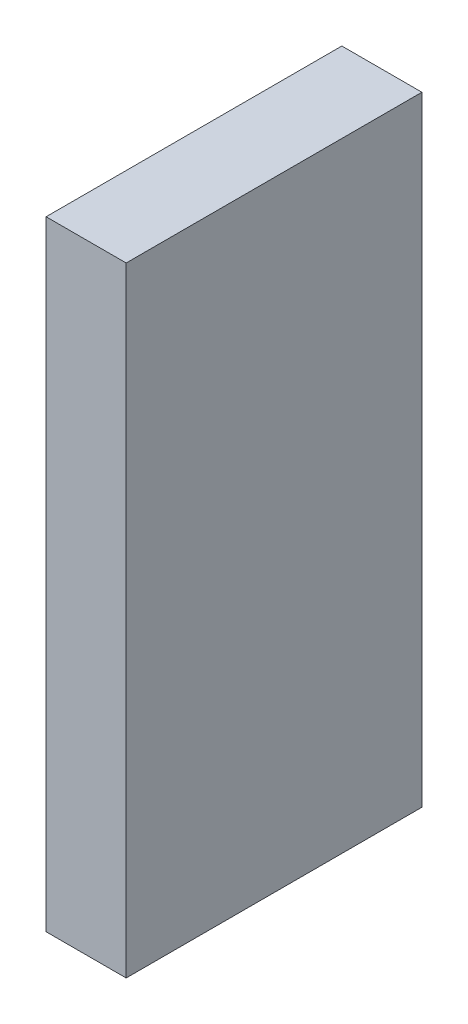
ISO-10303-21;
HEADER;
FILE_DESCRIPTION(('STEP AP214'),'2;1');
FILE_NAME('part.step','',(''),(''),'','','');
FILE_SCHEMA(('AUTOMOTIVE_DESIGN { 1 0 10303 214 1 1 1 1 }'));
ENDSEC;
DATA;
#1=APPLICATION_CONTEXT('core data for automotive mechanical design processes');
#2=APPLICATION_PROTOCOL_DEFINITION('international standard','automotive_design',2000,#1);
#3=PRODUCT_CONTEXT('',#1,'mechanical');
#4=PRODUCT('Part','Part','',(#3));
#5=PRODUCT_RELATED_PRODUCT_CATEGORY('part','',(#4));
#6=PRODUCT_DEFINITION_FORMATION('','',#4);
#7=PRODUCT_DEFINITION_CONTEXT('part definition',#1,'design');
#8=PRODUCT_DEFINITION('design','',#6,#7);
#9=PRODUCT_DEFINITION_SHAPE('','',#8);
#10=(LENGTH_UNIT() NAMED_UNIT(*) SI_UNIT(.MILLI.,.METRE.));
#11=(NAMED_UNIT(*) PLANE_ANGLE_UNIT() SI_UNIT($,.RADIAN.));
#12=(NAMED_UNIT(*) SI_UNIT($,.STERADIAN.) SOLID_ANGLE_UNIT());
#13=UNCERTAINTY_MEASURE_WITH_UNIT(LENGTH_MEASURE(1.E-05),#10,'distance_accuracy_value','');
#14=(GEOMETRIC_REPRESENTATION_CONTEXT(3) GLOBAL_UNCERTAINTY_ASSIGNED_CONTEXT((#13)) GLOBAL_UNIT_ASSIGNED_CONTEXT((#10,
#11,#12)) REPRESENTATION_CONTEXT('',''));
#15=CARTESIAN_POINT('',(0.,0.,0.));
#16=DIRECTION('',(0.,0.,1.));
#17=DIRECTION('',(1.,0.,0.));
#18=AXIS2_PLACEMENT_3D('',#15,#16,#17);
#19=CARTESIAN_POINT('',(15.,0.,0.));
#20=DIRECTION('',(0.,0.,-1.));
#21=DIRECTION('',(-1.,0.,0.));
#22=AXIS2_PLACEMENT_3D('',#19,#20,#21);
#23=PLANE('',#22);
#24=DIRECTION('',(0.,-1.,0.));
#25=VECTOR('',#24,1.);
#26=CARTESIAN_POINT('',(0.,0.,0.));
#27=LINE('',#26,#25);
#28=CARTESIAN_POINT('',(0.,116.,0.));
#29=VERTEX_POINT('',#28);
#30=CARTESIAN_POINT('',(0.,0.,0.));
#31=VERTEX_POINT('',#30);
#32=EDGE_CURVE('E96',#29,#31,#27,.T.);
#33=ORIENTED_EDGE('',*,*,#32,.T.);
#34=DIRECTION('',(-1.,0.,0.));
#35=VECTOR('',#34,1.);
#36=CARTESIAN_POINT('',(15.,0.,0.));
#37=LINE('',#36,#35);
#38=CARTESIAN_POINT('',(15.,0.,0.));
#39=VERTEX_POINT('',#38);
#40=EDGE_CURVE('E11',#39,#31,#37,.T.);
#41=ORIENTED_EDGE('',*,*,#40,.F.);
#42=DIRECTION('',(0.,-1.,0.));
#43=VECTOR('',#42,1.);
#44=CARTESIAN_POINT('',(15.,0.,0.));
#45=LINE('',#44,#43);
#46=CARTESIAN_POINT('',(15.,116.,0.));
#47=VERTEX_POINT('',#46);
#48=EDGE_CURVE('E84',#47,#39,#45,.T.);
#49=ORIENTED_EDGE('',*,*,#48,.F.);
#50=DIRECTION('',(-1.,0.,0.));
#51=VECTOR('',#50,1.);
#52=CARTESIAN_POINT('',(15.,116.,0.));
#53=LINE('',#52,#51);
#54=EDGE_CURVE('E92',#47,#29,#53,.T.);
#55=ORIENTED_EDGE('',*,*,#54,.T.);
#56=EDGE_LOOP('',(#33,#41,#49,#55));
#57=FACE_BOUND('',#56,.T.);
#58=ADVANCED_FACE('F33',(#57),#23,.F.);
#59=CARTESIAN_POINT('',(15.,0.,0.));
#60=DIRECTION('',(0.,1.,0.));
#61=DIRECTION('',(0.,0.,1.));
#62=AXIS2_PLACEMENT_3D('',#59,#60,#61);
#63=PLANE('',#62);
#64=DIRECTION('',(0.,0.,-1.));
#65=VECTOR('',#64,1.);
#66=CARTESIAN_POINT('',(0.,0.,0.));
#67=LINE('',#66,#65);
#68=CARTESIAN_POINT('',(0.,0.,-55.4));
#69=VERTEX_POINT('',#68);
#70=EDGE_CURVE('E88',#31,#69,#67,.T.);
#71=ORIENTED_EDGE('',*,*,#70,.T.);
#72=DIRECTION('',(-1.,0.,0.));
#73=VECTOR('',#72,1.);
#74=CARTESIAN_POINT('',(15.,0.,-55.4));
#75=LINE('',#74,#73);
#76=CARTESIAN_POINT('',(15.,0.,-55.4));
#77=VERTEX_POINT('',#76);
#78=EDGE_CURVE('E41',#77,#69,#75,.T.);
#79=ORIENTED_EDGE('',*,*,#78,.F.);
#80=DIRECTION('',(0.,0.,-1.));
#81=VECTOR('',#80,1.);
#82=CARTESIAN_POINT('',(15.,0.,0.));
#83=LINE('',#82,#81);
#84=EDGE_CURVE('E79',#39,#77,#83,.T.);
#85=ORIENTED_EDGE('',*,*,#84,.F.);
#86=ORIENTED_EDGE('',*,*,#40,.T.);
#87=EDGE_LOOP('',(#71,#79,#85,#86));
#88=FACE_BOUND('',#87,.T.);
#89=ADVANCED_FACE('F87',(#88),#63,.F.);
#90=CARTESIAN_POINT('',(15.,0.,-55.4));
#91=DIRECTION('',(0.,0.,1.));
#92=DIRECTION('',(1.,0.,0.));
#93=AXIS2_PLACEMENT_3D('',#90,#91,#92);
#94=PLANE('',#93);
#95=DIRECTION('',(0.,1.,0.));
#96=VECTOR('',#95,1.);
#97=CARTESIAN_POINT('',(0.,0.,-55.4));
#98=LINE('',#97,#96);
#99=CARTESIAN_POINT('',(0.,116.,-55.4));
#100=VERTEX_POINT('',#99);
#101=EDGE_CURVE('E66',#69,#100,#98,.T.);
#102=ORIENTED_EDGE('',*,*,#101,.T.);
#103=DIRECTION('',(-1.,0.,0.));
#104=VECTOR('',#103,1.);
#105=CARTESIAN_POINT('',(15.,116.,-55.4));
#106=LINE('',#105,#104);
#107=CARTESIAN_POINT('',(15.,116.,-55.4));
#108=VERTEX_POINT('',#107);
#109=EDGE_CURVE('E89',#108,#100,#106,.T.);
#110=ORIENTED_EDGE('',*,*,#109,.F.);
#111=DIRECTION('',(0.,1.,0.));
#112=VECTOR('',#111,1.);
#113=CARTESIAN_POINT('',(15.,0.,-55.4));
#114=LINE('',#113,#112);
#115=EDGE_CURVE('E82',#77,#108,#114,.T.);
#116=ORIENTED_EDGE('',*,*,#115,.F.);
#117=ORIENTED_EDGE('',*,*,#78,.T.);
#118=EDGE_LOOP('',(#102,#110,#116,#117));
#119=FACE_BOUND('',#118,.T.);
#120=ADVANCED_FACE('F90',(#119),#94,.F.);
#121=CARTESIAN_POINT('',(15.,116.,0.));
#122=DIRECTION('',(0.,-1.,0.));
#123=DIRECTION('',(0.,0.,-1.));
#124=AXIS2_PLACEMENT_3D('',#121,#122,#123);
#125=PLANE('',#124);
#126=DIRECTION('',(0.,0.,1.));
#127=VECTOR('',#126,1.);
#128=CARTESIAN_POINT('',(0.,116.,0.));
#129=LINE('',#128,#127);
#130=EDGE_CURVE('E72',#100,#29,#129,.T.);
#131=ORIENTED_EDGE('',*,*,#130,.T.);
#132=ORIENTED_EDGE('',*,*,#54,.F.);
#133=DIRECTION('',(0.,0.,1.));
#134=VECTOR('',#133,1.);
#135=CARTESIAN_POINT('',(15.,116.,0.));
#136=LINE('',#135,#134);
#137=EDGE_CURVE('E49',#108,#47,#136,.T.);
#138=ORIENTED_EDGE('',*,*,#137,.F.);
#139=ORIENTED_EDGE('',*,*,#109,.T.);
#140=EDGE_LOOP('',(#131,#132,#138,#139));
#141=FACE_BOUND('',#140,.T.);
#142=ADVANCED_FACE('F103',(#141),#125,.F.);
#143=CARTESIAN_POINT('',(15.,0.,0.));
#144=DIRECTION('',(-1.,0.,0.));
#145=DIRECTION('',(0.,0.,1.));
#146=AXIS2_PLACEMENT_3D('',#143,#144,#145);
#147=PLANE('',#146);
#148=ORIENTED_EDGE('',*,*,#48,.T.);
#149=ORIENTED_EDGE('',*,*,#84,.T.);
#150=ORIENTED_EDGE('',*,*,#115,.T.);
#151=ORIENTED_EDGE('',*,*,#137,.T.);
#152=EDGE_LOOP('',(#148,#149,#150,#151));
#153=FACE_BOUND('',#152,.T.);
#154=ADVANCED_FACE('F80',(#153),#147,.F.);
#155=CARTESIAN_POINT('',(0.,0.,0.));
#156=DIRECTION('',(-1.,0.,0.));
#157=DIRECTION('',(0.,0.,1.));
#158=AXIS2_PLACEMENT_3D('',#155,#156,#157);
#159=PLANE('',#158);
#160=ORIENTED_EDGE('',*,*,#32,.F.);
#161=ORIENTED_EDGE('',*,*,#130,.F.);
#162=ORIENTED_EDGE('',*,*,#101,.F.);
#163=ORIENTED_EDGE('',*,*,#70,.F.);
#164=EDGE_LOOP('',(#160,#161,#162,#163));
#165=FACE_BOUND('',#164,.T.);
#166=ADVANCED_FACE('F106',(#165),#159,.T.);
#167=CLOSED_SHELL('',(#58,#89,#120,#142,#154,#166));
#168=MANIFOLD_SOLID_BREP('B2',#167);
#169=ADVANCED_BREP_SHAPE_REPRESENTATION('',(#18,#168),#14);
#170=SHAPE_DEFINITION_REPRESENTATION(#9,#169);
ENDSEC;
END-ISO-10303-21;
